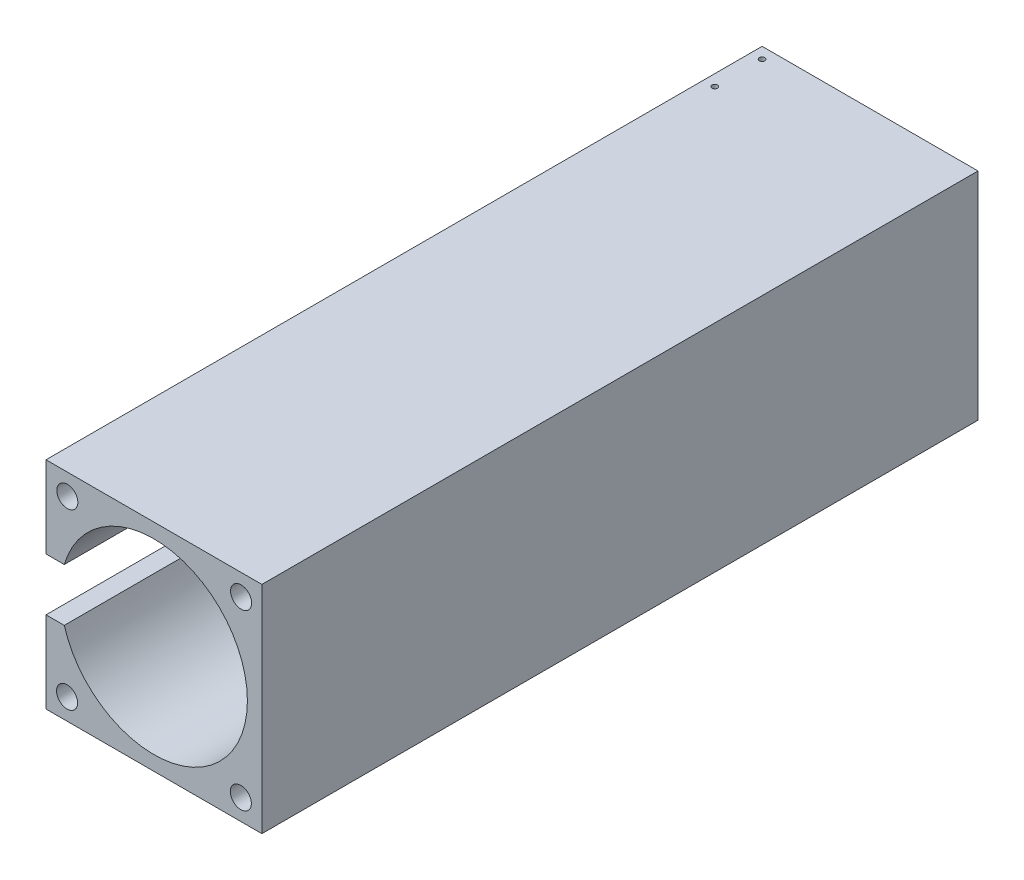
ISO-10303-21;
HEADER;
FILE_DESCRIPTION(('STEP AP214'),'2;1');
FILE_NAME('part.step','',(''),(''),'','','');
FILE_SCHEMA(('AUTOMOTIVE_DESIGN { 1 0 10303 214 1 1 1 1 }'));
ENDSEC;
DATA;
#1=APPLICATION_CONTEXT('core data for automotive mechanical design processes');
#2=APPLICATION_PROTOCOL_DEFINITION('international standard','automotive_design',2000,#1);
#3=PRODUCT_CONTEXT('',#1,'mechanical');
#4=PRODUCT('Part','Part','',(#3));
#5=PRODUCT_RELATED_PRODUCT_CATEGORY('part','',(#4));
#6=PRODUCT_DEFINITION_FORMATION('','',#4);
#7=PRODUCT_DEFINITION_CONTEXT('part definition',#1,'design');
#8=PRODUCT_DEFINITION('design','',#6,#7);
#9=PRODUCT_DEFINITION_SHAPE('','',#8);
#10=(LENGTH_UNIT() NAMED_UNIT(*) SI_UNIT(.MILLI.,.METRE.));
#11=(NAMED_UNIT(*) PLANE_ANGLE_UNIT() SI_UNIT($,.RADIAN.));
#12=(NAMED_UNIT(*) SI_UNIT($,.STERADIAN.) SOLID_ANGLE_UNIT());
#13=UNCERTAINTY_MEASURE_WITH_UNIT(LENGTH_MEASURE(1.E-05),#10,'distance_accuracy_value','');
#14=(GEOMETRIC_REPRESENTATION_CONTEXT(3) GLOBAL_UNCERTAINTY_ASSIGNED_CONTEXT((#13)) GLOBAL_UNIT_ASSIGNED_CONTEXT((#10,
#11,#12)) REPRESENTATION_CONTEXT('',''));
#15=CARTESIAN_POINT('',(0.,0.,0.));
#16=DIRECTION('',(0.,0.,1.));
#17=DIRECTION('',(1.,0.,0.));
#18=AXIS2_PLACEMENT_3D('',#15,#16,#17);
#19=CARTESIAN_POINT('',(0.,0.,245.));
#20=DIRECTION('',(0.,0.,-1.));
#21=DIRECTION('',(-1.,0.,0.));
#22=AXIS2_PLACEMENT_3D('',#19,#20,#21);
#23=PLANE('',#22);
#24=CARTESIAN_POINT('',(-32.9999999999981,-33.,245.));
#25=DIRECTION('',(0.,0.,1.));
#26=DIRECTION('',(1.,0.,0.));
#27=AXIS2_PLACEMENT_3D('',#24,#25,#26);
#28=CIRCLE('',#27,4.000000000001);
#29=CARTESIAN_POINT('',(-28.9999999999971,-33.,245.));
#30=VERTEX_POINT('',#29);
#31=EDGE_CURVE('E363',#30,#30,#28,.T.);
#32=ORIENTED_EDGE('',*,*,#31,.F.);
#33=EDGE_LOOP('',(#32));
#34=FACE_BOUND('',#33,.T.);
#35=CARTESIAN_POINT('',(33.0000000000019,-33.0999999999982,245.));
#36=DIRECTION('',(0.,0.,1.));
#37=DIRECTION('',(1.,0.,0.));
#38=AXIS2_PLACEMENT_3D('',#35,#36,#37);
#39=CIRCLE('',#38,4.00000000000001);
#40=CARTESIAN_POINT('',(37.0000000000019,-33.0999999999982,245.));
#41=VERTEX_POINT('',#40);
#42=EDGE_CURVE('E367',#41,#41,#39,.T.);
#43=ORIENTED_EDGE('',*,*,#42,.F.);
#44=EDGE_LOOP('',(#43));
#45=FACE_BOUND('',#44,.T.);
#46=CARTESIAN_POINT('',(33.1000000000001,32.9000000000018,245.));
#47=DIRECTION('',(0.,0.,1.));
#48=DIRECTION('',(1.,0.,0.));
#49=AXIS2_PLACEMENT_3D('',#46,#47,#48);
#50=CIRCLE('',#49,4.);
#51=CARTESIAN_POINT('',(37.1000000000001,32.9000000000018,245.));
#52=VERTEX_POINT('',#51);
#53=EDGE_CURVE('E362',#52,#52,#50,.T.);
#54=ORIENTED_EDGE('',*,*,#53,.F.);
#55=EDGE_LOOP('',(#54));
#56=FACE_BOUND('',#55,.T.);
#57=CARTESIAN_POINT('',(-32.9,33.,245.));
#58=DIRECTION('',(0.,0.,1.));
#59=DIRECTION('',(1.,0.,0.));
#60=AXIS2_PLACEMENT_3D('',#57,#58,#59);
#61=CIRCLE('',#60,4.);
#62=CARTESIAN_POINT('',(-28.9,33.,245.));
#63=VERTEX_POINT('',#62);
#64=EDGE_CURVE('E357',#63,#63,#61,.T.);
#65=ORIENTED_EDGE('',*,*,#64,.F.);
#66=EDGE_LOOP('',(#65));
#67=FACE_BOUND('',#66,.T.);
#68=CARTESIAN_POINT('',(0.,0.,245.));
#69=DIRECTION('',(0.,0.,1.));
#70=DIRECTION('',(1.,0.,0.));
#71=AXIS2_PLACEMENT_3D('',#68,#69,#70);
#72=CIRCLE('',#71,35.5);
#73=CARTESIAN_POINT('',(-34.0624426605022,-10.,245.));
#74=VERTEX_POINT('',#73);
#75=CARTESIAN_POINT('',(-34.0624426605022,10.,245.));
#76=VERTEX_POINT('',#75);
#77=EDGE_CURVE('E136',#74,#76,#72,.T.);
#78=ORIENTED_EDGE('',*,*,#77,.F.);
#79=DIRECTION('',(1.,0.,0.));
#80=VECTOR('',#79,1.);
#81=CARTESIAN_POINT('',(-41.,-10.,245.));
#82=LINE('',#81,#80);
#83=CARTESIAN_POINT('',(-41.,-10.,245.));
#84=VERTEX_POINT('',#83);
#85=EDGE_CURVE('E116',#84,#74,#82,.T.);
#86=ORIENTED_EDGE('',*,*,#85,.F.);
#87=DIRECTION('',(0.,-1.,0.));
#88=VECTOR('',#87,1.);
#89=CARTESIAN_POINT('',(-41.,-41.,245.));
#90=LINE('',#89,#88);
#91=CARTESIAN_POINT('',(-41.,-41.,245.));
#92=VERTEX_POINT('',#91);
#93=EDGE_CURVE('E130',#84,#92,#90,.T.);
#94=ORIENTED_EDGE('',*,*,#93,.T.);
#95=DIRECTION('',(1.,0.,0.));
#96=VECTOR('',#95,1.);
#97=CARTESIAN_POINT('',(-41.,-41.,245.));
#98=LINE('',#97,#96);
#99=CARTESIAN_POINT('',(41.,-41.,245.));
#100=VERTEX_POINT('',#99);
#101=EDGE_CURVE('E129',#92,#100,#98,.T.);
#102=ORIENTED_EDGE('',*,*,#101,.T.);
#103=DIRECTION('',(0.,1.,0.));
#104=VECTOR('',#103,1.);
#105=CARTESIAN_POINT('',(41.,-41.,245.));
#106=LINE('',#105,#104);
#107=CARTESIAN_POINT('',(41.,41.,245.));
#108=VERTEX_POINT('',#107);
#109=EDGE_CURVE('E134',#100,#108,#106,.T.);
#110=ORIENTED_EDGE('',*,*,#109,.T.);
#111=DIRECTION('',(-1.,0.,0.));
#112=VECTOR('',#111,1.);
#113=CARTESIAN_POINT('',(-41.,41.,245.));
#114=LINE('',#113,#112);
#115=CARTESIAN_POINT('',(-41.,41.,245.));
#116=VERTEX_POINT('',#115);
#117=EDGE_CURVE('E65',#108,#116,#114,.T.);
#118=ORIENTED_EDGE('',*,*,#117,.T.);
#119=CARTESIAN_POINT('',(-41.,10.,245.));
#120=VERTEX_POINT('',#119);
#121=EDGE_CURVE('E122',#116,#120,#90,.T.);
#122=ORIENTED_EDGE('',*,*,#121,.T.);
#123=DIRECTION('',(-1.,0.,0.));
#124=VECTOR('',#123,1.);
#125=CARTESIAN_POINT('',(-41.,10.,245.));
#126=LINE('',#125,#124);
#127=EDGE_CURVE('E106',#76,#120,#126,.T.);
#128=ORIENTED_EDGE('',*,*,#127,.F.);
#129=EDGE_LOOP('',(#78,#86,#94,#102,#110,#118,#122,#128));
#130=FACE_BOUND('',#129,.T.);
#131=ADVANCED_FACE('F40',(#34,#45,#56,#67,#130),#23,.F.);
#132=CARTESIAN_POINT('',(-41.,-41.,245.));
#133=DIRECTION('',(1.,0.,0.));
#134=DIRECTION('',(0.,0.,-1.));
#135=AXIS2_PLACEMENT_3D('',#132,#133,#134);
#136=PLANE('',#135);
#137=ORIENTED_EDGE('',*,*,#93,.F.);
#138=DIRECTION('',(0.,0.,1.));
#139=VECTOR('',#138,1.);
#140=CARTESIAN_POINT('',(-41.,-10.,-21.540659228538));
#141=LINE('',#140,#139);
#142=CARTESIAN_POINT('',(-41.,-10.,0.));
#143=VERTEX_POINT('',#142);
#144=EDGE_CURVE('E347',#143,#84,#141,.T.);
#145=ORIENTED_EDGE('',*,*,#144,.F.);
#146=DIRECTION('',(0.,-1.,0.));
#147=VECTOR('',#146,1.);
#148=CARTESIAN_POINT('',(-41.,10.,0.));
#149=LINE('',#148,#147);
#150=CARTESIAN_POINT('',(-41.,10.,0.));
#151=VERTEX_POINT('',#150);
#152=EDGE_CURVE('E125',#151,#143,#149,.T.);
#153=ORIENTED_EDGE('',*,*,#152,.F.);
#154=DIRECTION('',(0.,0.,1.));
#155=VECTOR('',#154,1.);
#156=CARTESIAN_POINT('',(-41.,10.,-21.540659228538));
#157=LINE('',#156,#155);
#158=EDGE_CURVE('E109',#151,#120,#157,.T.);
#159=ORIENTED_EDGE('',*,*,#158,.T.);
#160=ORIENTED_EDGE('',*,*,#121,.F.);
#161=DIRECTION('',(0.,0.,-1.));
#162=VECTOR('',#161,1.);
#163=CARTESIAN_POINT('',(-41.,41.,245.));
#164=LINE('',#163,#162);
#165=CARTESIAN_POINT('',(-41.,41.,-27.));
#166=VERTEX_POINT('',#165);
#167=EDGE_CURVE('E145',#116,#166,#164,.T.);
#168=ORIENTED_EDGE('',*,*,#167,.T.);
#169=DIRECTION('',(0.,1.,0.));
#170=VECTOR('',#169,1.);
#171=CARTESIAN_POINT('',(-41.,41.,-27.));
#172=LINE('',#171,#170);
#173=CARTESIAN_POINT('',(-41.,-41.,-27.));
#174=VERTEX_POINT('',#173);
#175=EDGE_CURVE('E326',#174,#166,#172,.T.);
#176=ORIENTED_EDGE('',*,*,#175,.F.);
#177=DIRECTION('',(0.,0.,-1.));
#178=VECTOR('',#177,1.);
#179=CARTESIAN_POINT('',(-41.,-41.,245.));
#180=LINE('',#179,#178);
#181=EDGE_CURVE('E154',#92,#174,#180,.T.);
#182=ORIENTED_EDGE('',*,*,#181,.F.);
#183=EDGE_LOOP('',(#137,#145,#153,#159,#160,#168,#176,#182));
#184=FACE_BOUND('',#183,.T.);
#185=ADVANCED_FACE('F121',(#184),#136,.F.);
#186=CARTESIAN_POINT('',(-41.,-41.,245.));
#187=DIRECTION('',(0.,1.,0.));
#188=DIRECTION('',(0.,0.,1.));
#189=AXIS2_PLACEMENT_3D('',#186,#187,#188);
#190=PLANE('',#189);
#191=ORIENTED_EDGE('',*,*,#181,.T.);
#192=DIRECTION('',(-1.,0.,0.));
#193=VECTOR('',#192,1.);
#194=CARTESIAN_POINT('',(41.,-41.,-27.));
#195=LINE('',#194,#193);
#196=CARTESIAN_POINT('',(41.,-41.,-27.));
#197=VERTEX_POINT('',#196);
#198=EDGE_CURVE('E333',#197,#174,#195,.T.);
#199=ORIENTED_EDGE('',*,*,#198,.F.);
#200=DIRECTION('',(0.,0.,-1.));
#201=VECTOR('',#200,1.);
#202=CARTESIAN_POINT('',(41.,-41.,245.));
#203=LINE('',#202,#201);
#204=EDGE_CURVE('E151',#100,#197,#203,.T.);
#205=ORIENTED_EDGE('',*,*,#204,.F.);
#206=ORIENTED_EDGE('',*,*,#101,.F.);
#207=EDGE_LOOP('',(#191,#199,#205,#206));
#208=FACE_BOUND('',#207,.T.);
#209=ADVANCED_FACE('F241',(#208),#190,.F.);
#210=CARTESIAN_POINT('',(41.,-41.,245.));
#211=DIRECTION('',(-1.,0.,0.));
#212=DIRECTION('',(0.,0.,1.));
#213=AXIS2_PLACEMENT_3D('',#210,#211,#212);
#214=PLANE('',#213);
#215=ORIENTED_EDGE('',*,*,#204,.T.);
#216=DIRECTION('',(0.,-1.,0.));
#217=VECTOR('',#216,1.);
#218=CARTESIAN_POINT('',(41.,41.,-27.));
#219=LINE('',#218,#217);
#220=CARTESIAN_POINT('',(41.,41.,-27.));
#221=VERTEX_POINT('',#220);
#222=EDGE_CURVE('E339',#221,#197,#219,.T.);
#223=ORIENTED_EDGE('',*,*,#222,.F.);
#224=DIRECTION('',(0.,0.,-1.));
#225=VECTOR('',#224,1.);
#226=CARTESIAN_POINT('',(41.,41.,245.));
#227=LINE('',#226,#225);
#228=EDGE_CURVE('E148',#108,#221,#227,.T.);
#229=ORIENTED_EDGE('',*,*,#228,.F.);
#230=ORIENTED_EDGE('',*,*,#109,.F.);
#231=EDGE_LOOP('',(#215,#223,#229,#230));
#232=FACE_BOUND('',#231,.T.);
#233=ADVANCED_FACE('F252',(#232),#214,.F.);
#234=CARTESIAN_POINT('',(-41.,41.,245.));
#235=DIRECTION('',(0.,-1.,0.));
#236=DIRECTION('',(0.,0.,-1.));
#237=AXIS2_PLACEMENT_3D('',#234,#235,#236);
#238=PLANE('',#237);
#239=CARTESIAN_POINT('',(-36.75,41.,-22.75));
#240=DIRECTION('',(0.,1.,0.));
#241=DIRECTION('',(0.,0.,1.));
#242=AXIS2_PLACEMENT_3D('',#239,#240,#241);
#243=CIRCLE('',#242,1.05);
#244=CARTESIAN_POINT('',(-36.75,41.,-21.7));
#245=VERTEX_POINT('',#244);
#246=EDGE_CURVE('E384',#245,#245,#243,.T.);
#247=ORIENTED_EDGE('',*,*,#246,.F.);
#248=EDGE_LOOP('',(#247));
#249=FACE_BOUND('',#248,.T.);
#250=CARTESIAN_POINT('',(-36.75,41.,-4.74999999999999));
#251=DIRECTION('',(0.,1.,0.));
#252=DIRECTION('',(0.,0.,1.));
#253=AXIS2_PLACEMENT_3D('',#250,#251,#252);
#254=CIRCLE('',#253,1.05);
#255=CARTESIAN_POINT('',(-36.75,41.,-3.69999999999999));
#256=VERTEX_POINT('',#255);
#257=EDGE_CURVE('E375',#256,#256,#254,.T.);
#258=ORIENTED_EDGE('',*,*,#257,.F.);
#259=EDGE_LOOP('',(#258));
#260=FACE_BOUND('',#259,.T.);
#261=ORIENTED_EDGE('',*,*,#228,.T.);
#262=DIRECTION('',(1.,0.,0.));
#263=VECTOR('',#262,1.);
#264=CARTESIAN_POINT('',(41.,41.,-27.));
#265=LINE('',#264,#263);
#266=EDGE_CURVE('E322',#166,#221,#265,.T.);
#267=ORIENTED_EDGE('',*,*,#266,.F.);
#268=ORIENTED_EDGE('',*,*,#167,.F.);
#269=ORIENTED_EDGE('',*,*,#117,.F.);
#270=EDGE_LOOP('',(#261,#267,#268,#269));
#271=FACE_BOUND('',#270,.T.);
#272=ADVANCED_FACE('F249',(#249,#260,#271),#238,.F.);
#273=CARTESIAN_POINT('',(0.,0.,245.));
#274=DIRECTION('',(0.,0.,-1.));
#275=DIRECTION('',(-1.,0.,0.));
#276=AXIS2_PLACEMENT_3D('',#273,#274,#275);
#277=CYLINDRICAL_SURFACE('',#276,35.5);
#278=DIRECTION('',(0.,0.,-1.));
#279=VECTOR('',#278,1.);
#280=CARTESIAN_POINT('',(-34.0624426605022,-10.,245.));
#281=LINE('',#280,#279);
#282=CARTESIAN_POINT('',(-34.0624426605022,-10.,0.));
#283=VERTEX_POINT('',#282);
#284=EDGE_CURVE('E342',#74,#283,#281,.T.);
#285=ORIENTED_EDGE('',*,*,#284,.F.);
#286=ORIENTED_EDGE('',*,*,#77,.T.);
#287=DIRECTION('',(0.,0.,-1.));
#288=VECTOR('',#287,1.);
#289=CARTESIAN_POINT('',(-34.0624426605022,10.,245.));
#290=LINE('',#289,#288);
#291=CARTESIAN_POINT('',(-34.0624426605022,10.,0.));
#292=VERTEX_POINT('',#291);
#293=EDGE_CURVE('E111',#292,#76,#290,.F.);
#294=ORIENTED_EDGE('',*,*,#293,.F.);
#295=CARTESIAN_POINT('',(0.,0.,0.));
#296=DIRECTION('',(0.,0.,1.));
#297=DIRECTION('',(1.,0.,0.));
#298=AXIS2_PLACEMENT_3D('',#295,#296,#297);
#299=CIRCLE('',#298,35.5);
#300=EDGE_CURVE('E138',#283,#292,#299,.T.);
#301=ORIENTED_EDGE('',*,*,#300,.F.);
#302=EDGE_LOOP('',(#285,#286,#294,#301));
#303=FACE_BOUND('',#302,.T.);
#304=ADVANCED_FACE('F247',(#303),#277,.F.);
#305=CARTESIAN_POINT('',(0.,0.,0.));
#306=DIRECTION('',(0.,0.,-1.));
#307=DIRECTION('',(-1.,0.,0.));
#308=AXIS2_PLACEMENT_3D('',#305,#306,#307);
#309=PLANE('',#308);
#310=ORIENTED_EDGE('',*,*,#300,.T.);
#311=DIRECTION('',(-1.,0.,0.));
#312=VECTOR('',#311,1.);
#313=CARTESIAN_POINT('',(-41.,10.,0.));
#314=LINE('',#313,#312);
#315=EDGE_CURVE('E57',#292,#151,#314,.T.);
#316=ORIENTED_EDGE('',*,*,#315,.T.);
#317=ORIENTED_EDGE('',*,*,#152,.T.);
#318=DIRECTION('',(1.,0.,0.));
#319=VECTOR('',#318,1.);
#320=CARTESIAN_POINT('',(-41.,-10.,0.));
#321=LINE('',#320,#319);
#322=EDGE_CURVE('E115',#143,#283,#321,.T.);
#323=ORIENTED_EDGE('',*,*,#322,.T.);
#324=EDGE_LOOP('',(#310,#316,#317,#323));
#325=FACE_BOUND('',#324,.T.);
#326=ADVANCED_FACE('F309',(#325),#309,.F.);
#327=CARTESIAN_POINT('',(0.,0.,-27.));
#328=DIRECTION('',(0.,0.,-1.));
#329=DIRECTION('',(-1.,0.,0.));
#330=AXIS2_PLACEMENT_3D('',#327,#328,#329);
#331=PLANE('',#330);
#332=ORIENTED_EDGE('',*,*,#222,.T.);
#333=ORIENTED_EDGE('',*,*,#198,.T.);
#334=ORIENTED_EDGE('',*,*,#175,.T.);
#335=ORIENTED_EDGE('',*,*,#266,.T.);
#336=EDGE_LOOP('',(#332,#333,#334,#335));
#337=FACE_BOUND('',#336,.T.);
#338=ADVANCED_FACE('F306',(#337),#331,.T.);
#339=CARTESIAN_POINT('',(-41.,-10.,-21.540659228538));
#340=DIRECTION('',(0.,-1.,0.));
#341=DIRECTION('',(0.,0.,-1.));
#342=AXIS2_PLACEMENT_3D('',#339,#340,#341);
#343=PLANE('',#342);
#344=ORIENTED_EDGE('',*,*,#284,.T.);
#345=ORIENTED_EDGE('',*,*,#322,.F.);
#346=ORIENTED_EDGE('',*,*,#144,.T.);
#347=ORIENTED_EDGE('',*,*,#85,.T.);
#348=EDGE_LOOP('',(#344,#345,#346,#347));
#349=FACE_BOUND('',#348,.T.);
#350=ADVANCED_FACE('F303',(#349),#343,.F.);
#351=CARTESIAN_POINT('',(-41.,10.,-21.540659228538));
#352=DIRECTION('',(0.,1.,0.));
#353=DIRECTION('',(0.,0.,1.));
#354=AXIS2_PLACEMENT_3D('',#351,#352,#353);
#355=PLANE('',#354);
#356=ORIENTED_EDGE('',*,*,#293,.T.);
#357=ORIENTED_EDGE('',*,*,#127,.T.);
#358=ORIENTED_EDGE('',*,*,#158,.F.);
#359=ORIENTED_EDGE('',*,*,#315,.F.);
#360=EDGE_LOOP('',(#356,#357,#358,#359));
#361=FACE_BOUND('',#360,.T.);
#362=ADVANCED_FACE('F108',(#361),#355,.F.);
#363=CARTESIAN_POINT('',(-32.9,33.,225.));
#364=DIRECTION('',(0.,0.,1.));
#365=DIRECTION('',(1.,0.,0.));
#366=AXIS2_PLACEMENT_3D('',#363,#364,#365);
#367=CYLINDRICAL_SURFACE('',#366,4.);
#368=CARTESIAN_POINT('',(-32.9,33.,228.));
#369=DIRECTION('',(0.,0.,1.));
#370=DIRECTION('',(1.,0.,0.));
#371=AXIS2_PLACEMENT_3D('',#368,#369,#370);
#372=CIRCLE('',#371,4.);
#373=CARTESIAN_POINT('',(-28.9,33.,228.));
#374=VERTEX_POINT('',#373);
#375=EDGE_CURVE('E161',#374,#374,#372,.F.);
#376=ORIENTED_EDGE('',*,*,#375,.T.);
#377=EDGE_LOOP('',(#376));
#378=FACE_BOUND('',#377,.T.);
#379=ORIENTED_EDGE('',*,*,#64,.T.);
#380=EDGE_LOOP('',(#379));
#381=FACE_BOUND('',#380,.T.);
#382=ADVANCED_FACE('F296',(#378,#381),#367,.F.);
#383=CARTESIAN_POINT('',(-32.9,33.,225.));
#384=DIRECTION('',(0.,0.,1.));
#385=DIRECTION('',(1.,0.,0.));
#386=AXIS2_PLACEMENT_3D('',#383,#384,#385);
#387=PLANE('',#386);
#388=CARTESIAN_POINT('',(-32.9,33.,225.));
#389=DIRECTION('',(0.,0.,1.));
#390=DIRECTION('',(1.,0.,0.));
#391=AXIS2_PLACEMENT_3D('',#388,#389,#390);
#392=CIRCLE('',#391,1.);
#393=CARTESIAN_POINT('',(-31.9,33.,225.));
#394=VERTEX_POINT('',#393);
#395=EDGE_CURVE('E157',#394,#394,#392,.T.);
#396=ORIENTED_EDGE('',*,*,#395,.T.);
#397=EDGE_LOOP('',(#396));
#398=FACE_BOUND('',#397,.T.);
#399=ADVANCED_FACE('F292',(#398),#387,.T.);
#400=CARTESIAN_POINT('',(33.1000000000001,32.9000000000018,225.));
#401=DIRECTION('',(0.,0.,1.));
#402=DIRECTION('',(1.,0.,0.));
#403=AXIS2_PLACEMENT_3D('',#400,#401,#402);
#404=CYLINDRICAL_SURFACE('',#403,4.);
#405=CARTESIAN_POINT('',(33.1000000000001,32.9000000000018,228.));
#406=DIRECTION('',(0.,0.,1.));
#407=DIRECTION('',(1.,0.,0.));
#408=AXIS2_PLACEMENT_3D('',#405,#406,#407);
#409=CIRCLE('',#408,4.);
#410=CARTESIAN_POINT('',(37.1000000000001,32.9000000000018,228.));
#411=VERTEX_POINT('',#410);
#412=EDGE_CURVE('E169',#411,#411,#409,.F.);
#413=ORIENTED_EDGE('',*,*,#412,.T.);
#414=EDGE_LOOP('',(#413));
#415=FACE_BOUND('',#414,.T.);
#416=ORIENTED_EDGE('',*,*,#53,.T.);
#417=EDGE_LOOP('',(#416));
#418=FACE_BOUND('',#417,.T.);
#419=ADVANCED_FACE('F295',(#415,#418),#404,.F.);
#420=CARTESIAN_POINT('',(33.1000000000001,32.9000000000018,225.));
#421=DIRECTION('',(0.,0.,1.));
#422=DIRECTION('',(1.,0.,0.));
#423=AXIS2_PLACEMENT_3D('',#420,#421,#422);
#424=PLANE('',#423);
#425=CARTESIAN_POINT('',(33.1000000000001,32.9000000000018,225.));
#426=DIRECTION('',(0.,0.,1.));
#427=DIRECTION('',(1.,0.,0.));
#428=AXIS2_PLACEMENT_3D('',#425,#426,#427);
#429=CIRCLE('',#428,0.999999999999997);
#430=CARTESIAN_POINT('',(34.1,32.9000000000018,225.));
#431=VERTEX_POINT('',#430);
#432=EDGE_CURVE('E165',#431,#431,#429,.T.);
#433=ORIENTED_EDGE('',*,*,#432,.T.);
#434=EDGE_LOOP('',(#433));
#435=FACE_BOUND('',#434,.T.);
#436=ADVANCED_FACE('F511',(#435),#424,.T.);
#437=CARTESIAN_POINT('',(33.0000000000019,-33.0999999999982,225.));
#438=DIRECTION('',(0.,0.,1.));
#439=DIRECTION('',(1.,0.,0.));
#440=AXIS2_PLACEMENT_3D('',#437,#438,#439);
#441=CYLINDRICAL_SURFACE('',#440,4.00000000000001);
#442=CARTESIAN_POINT('',(33.0000000000019,-33.0999999999982,228.));
#443=DIRECTION('',(0.,0.,1.));
#444=DIRECTION('',(1.,0.,0.));
#445=AXIS2_PLACEMENT_3D('',#442,#443,#444);
#446=CIRCLE('',#445,4.00000000000001);
#447=CARTESIAN_POINT('',(37.0000000000019,-33.0999999999982,228.));
#448=VERTEX_POINT('',#447);
#449=EDGE_CURVE('E185',#448,#448,#446,.F.);
#450=ORIENTED_EDGE('',*,*,#449,.T.);
#451=EDGE_LOOP('',(#450));
#452=FACE_BOUND('',#451,.T.);
#453=ORIENTED_EDGE('',*,*,#42,.T.);
#454=EDGE_LOOP('',(#453));
#455=FACE_BOUND('',#454,.T.);
#456=ADVANCED_FACE('F289',(#452,#455),#441,.F.);
#457=CARTESIAN_POINT('',(33.0000000000019,-33.0999999999982,225.));
#458=DIRECTION('',(0.,0.,1.));
#459=DIRECTION('',(1.,0.,0.));
#460=AXIS2_PLACEMENT_3D('',#457,#458,#459);
#461=PLANE('',#460);
#462=CARTESIAN_POINT('',(33.0000000000019,-33.0999999999982,225.));
#463=DIRECTION('',(0.,0.,1.));
#464=DIRECTION('',(1.,0.,0.));
#465=AXIS2_PLACEMENT_3D('',#462,#463,#464);
#466=CIRCLE('',#465,1.00000000000001);
#467=CARTESIAN_POINT('',(34.0000000000019,-33.0999999999982,225.));
#468=VERTEX_POINT('',#467);
#469=EDGE_CURVE('E181',#468,#468,#466,.T.);
#470=ORIENTED_EDGE('',*,*,#469,.T.);
#471=EDGE_LOOP('',(#470));
#472=FACE_BOUND('',#471,.T.);
#473=ADVANCED_FACE('F285',(#472),#461,.T.);
#474=CARTESIAN_POINT('',(-32.9999999999981,-33.,225.));
#475=DIRECTION('',(0.,0.,1.));
#476=DIRECTION('',(1.,0.,0.));
#477=AXIS2_PLACEMENT_3D('',#474,#475,#476);
#478=CYLINDRICAL_SURFACE('',#477,4.000000000001);
#479=CARTESIAN_POINT('',(-32.9999999999981,-33.,228.));
#480=DIRECTION('',(0.,0.,1.));
#481=DIRECTION('',(1.,0.,0.));
#482=AXIS2_PLACEMENT_3D('',#479,#480,#481);
#483=CIRCLE('',#482,4.000000000001);
#484=CARTESIAN_POINT('',(-28.9999999999971,-33.,228.));
#485=VERTEX_POINT('',#484);
#486=EDGE_CURVE('E177',#485,#485,#483,.F.);
#487=ORIENTED_EDGE('',*,*,#486,.T.);
#488=EDGE_LOOP('',(#487));
#489=FACE_BOUND('',#488,.T.);
#490=ORIENTED_EDGE('',*,*,#31,.T.);
#491=EDGE_LOOP('',(#490));
#492=FACE_BOUND('',#491,.T.);
#493=ADVANCED_FACE('F280',(#489,#492),#478,.F.);
#494=CARTESIAN_POINT('',(-32.9999999999981,-33.,225.));
#495=DIRECTION('',(0.,0.,1.));
#496=DIRECTION('',(1.,0.,0.));
#497=AXIS2_PLACEMENT_3D('',#494,#495,#496);
#498=PLANE('',#497);
#499=CARTESIAN_POINT('',(-32.9999999999981,-33.,225.));
#500=DIRECTION('',(0.,0.,1.));
#501=DIRECTION('',(1.,0.,0.));
#502=AXIS2_PLACEMENT_3D('',#499,#500,#501);
#503=CIRCLE('',#502,1.000000000001);
#504=CARTESIAN_POINT('',(-31.9999999999971,-33.,225.));
#505=VERTEX_POINT('',#504);
#506=EDGE_CURVE('E173',#505,#505,#503,.T.);
#507=ORIENTED_EDGE('',*,*,#506,.T.);
#508=EDGE_LOOP('',(#507));
#509=FACE_BOUND('',#508,.T.);
#510=ADVANCED_FACE('F264',(#509),#498,.T.);
#511=CARTESIAN_POINT('',(-32.9,33.,228.));
#512=DIRECTION('',(0.,0.,1.));
#513=DIRECTION('',(1.,0.,0.));
#514=AXIS2_PLACEMENT_3D('',#511,#512,#513);
#515=DEGENERATE_TOROIDAL_SURFACE('',#514,1.,3.,.T.);
#516=ORIENTED_EDGE('',*,*,#375,.F.);
#517=EDGE_LOOP('',(#516));
#518=FACE_BOUND('',#517,.T.);
#519=ORIENTED_EDGE('',*,*,#395,.F.);
#520=EDGE_LOOP('',(#519));
#521=FACE_BOUND('',#520,.T.);
#522=ADVANCED_FACE('F260',(#518,#521),#515,.F.);
#523=CARTESIAN_POINT('',(33.1000000000001,32.9000000000018,228.));
#524=DIRECTION('',(0.,0.,1.));
#525=DIRECTION('',(1.,0.,0.));
#526=AXIS2_PLACEMENT_3D('',#523,#524,#525);
#527=DEGENERATE_TOROIDAL_SURFACE('',#526,0.999999999999997,3.,.T.);
#528=ORIENTED_EDGE('',*,*,#412,.F.);
#529=EDGE_LOOP('',(#528));
#530=FACE_BOUND('',#529,.T.);
#531=ORIENTED_EDGE('',*,*,#432,.F.);
#532=EDGE_LOOP('',(#531));
#533=FACE_BOUND('',#532,.T.);
#534=ADVANCED_FACE('F263',(#530,#533),#527,.F.);
#535=CARTESIAN_POINT('',(-32.9999999999981,-33.,228.));
#536=DIRECTION('',(0.,0.,1.));
#537=DIRECTION('',(1.,0.,0.));
#538=AXIS2_PLACEMENT_3D('',#535,#536,#537);
#539=DEGENERATE_TOROIDAL_SURFACE('',#538,1.000000000001,3.,.T.);
#540=ORIENTED_EDGE('',*,*,#486,.F.);
#541=EDGE_LOOP('',(#540));
#542=FACE_BOUND('',#541,.T.);
#543=ORIENTED_EDGE('',*,*,#506,.F.);
#544=EDGE_LOOP('',(#543));
#545=FACE_BOUND('',#544,.T.);
#546=ADVANCED_FACE('F267',(#542,#545),#539,.F.);
#547=CARTESIAN_POINT('',(33.0000000000019,-33.0999999999982,228.));
#548=DIRECTION('',(0.,0.,1.));
#549=DIRECTION('',(1.,0.,0.));
#550=AXIS2_PLACEMENT_3D('',#547,#548,#549);
#551=DEGENERATE_TOROIDAL_SURFACE('',#550,1.00000000000001,3.,.T.);
#552=ORIENTED_EDGE('',*,*,#449,.F.);
#553=EDGE_LOOP('',(#552));
#554=FACE_BOUND('',#553,.T.);
#555=ORIENTED_EDGE('',*,*,#469,.F.);
#556=EDGE_LOOP('',(#555));
#557=FACE_BOUND('',#556,.T.);
#558=ADVANCED_FACE('F42',(#554,#557),#551,.F.);
#559=CARTESIAN_POINT('',(-36.75,31.,-4.74999999999999));
#560=DIRECTION('',(0.,1.,0.));
#561=DIRECTION('',(0.,0.,1.));
#562=AXIS2_PLACEMENT_3D('',#559,#560,#561);
#563=CYLINDRICAL_SURFACE('',#562,1.05);
#564=CARTESIAN_POINT('',(-36.75,35.2,-4.74999999999999));
#565=DIRECTION('',(0.,1.,0.));
#566=DIRECTION('',(0.,0.,1.));
#567=AXIS2_PLACEMENT_3D('',#564,#565,#566);
#568=CIRCLE('',#567,1.05);
#569=CARTESIAN_POINT('',(-36.75,35.2,-3.69999999999999));
#570=VERTEX_POINT('',#569);
#571=EDGE_CURVE('E394',#570,#570,#568,.T.);
#572=ORIENTED_EDGE('',*,*,#571,.F.);
#573=EDGE_LOOP('',(#572));
#574=FACE_BOUND('',#573,.T.);
#575=ORIENTED_EDGE('',*,*,#257,.T.);
#576=EDGE_LOOP('',(#575));
#577=FACE_BOUND('',#576,.T.);
#578=ADVANCED_FACE('F211',(#574,#577),#563,.F.);
#579=CARTESIAN_POINT('',(-36.75,31.,-22.75));
#580=DIRECTION('',(0.,1.,0.));
#581=DIRECTION('',(0.,0.,1.));
#582=AXIS2_PLACEMENT_3D('',#579,#580,#581);
#583=CYLINDRICAL_SURFACE('',#582,1.05);
#584=CARTESIAN_POINT('',(-36.75,35.2,-22.75));
#585=DIRECTION('',(0.,1.,0.));
#586=DIRECTION('',(0.,0.,1.));
#587=AXIS2_PLACEMENT_3D('',#584,#585,#586);
#588=CIRCLE('',#587,1.05);
#589=CARTESIAN_POINT('',(-36.75,35.2,-21.7));
#590=VERTEX_POINT('',#589);
#591=EDGE_CURVE('E380',#590,#590,#588,.T.);
#592=ORIENTED_EDGE('',*,*,#591,.F.);
#593=EDGE_LOOP('',(#592));
#594=FACE_BOUND('',#593,.T.);
#595=ORIENTED_EDGE('',*,*,#246,.T.);
#596=EDGE_LOOP('',(#595));
#597=FACE_BOUND('',#596,.T.);
#598=ADVANCED_FACE('F200',(#594,#597),#583,.F.);
#599=CARTESIAN_POINT('',(-36.75,35.2,-22.75));
#600=DIRECTION('',(0.,1.,0.));
#601=DIRECTION('',(0.,0.,1.));
#602=AXIS2_PLACEMENT_3D('',#599,#600,#601);
#603=PLANE('',#602);
#604=ORIENTED_EDGE('',*,*,#591,.T.);
#605=EDGE_LOOP('',(#604));
#606=FACE_BOUND('',#605,.T.);
#607=ADVANCED_FACE('F210',(#606),#603,.T.);
#608=CARTESIAN_POINT('',(-36.75,35.2,-4.74999999999999));
#609=DIRECTION('',(0.,1.,0.));
#610=DIRECTION('',(0.,0.,1.));
#611=AXIS2_PLACEMENT_3D('',#608,#609,#610);
#612=PLANE('',#611);
#613=ORIENTED_EDGE('',*,*,#571,.T.);
#614=EDGE_LOOP('',(#613));
#615=FACE_BOUND('',#614,.T.);
#616=ADVANCED_FACE('F222',(#615),#612,.T.);
#617=CLOSED_SHELL('',(#131,#185,#209,#233,#272,#304,#326,#338,#350,#362,#382,#399,#419,#436,
#456,#473,#493,#510,#522,#534,#546,#558,#578,#598,#607,#616));
#618=CARTESIAN_POINT('',(-36.75,35.,-4.74999999999999));
#619=DIRECTION('',(0.,1.,0.));
#620=DIRECTION('',(0.,0.,1.));
#621=AXIS2_PLACEMENT_3D('',#618,#619,#620);
#622=PLANE('',#621);
#623=CARTESIAN_POINT('',(-36.75,35.,-4.74999999999999));
#624=DIRECTION('',(0.,1.,0.));
#625=DIRECTION('',(0.,0.,1.));
#626=AXIS2_PLACEMENT_3D('',#623,#624,#625);
#627=CIRCLE('',#626,1.05);
#628=CARTESIAN_POINT('',(-36.75,35.,-3.69999999999999));
#629=VERTEX_POINT('',#628);
#630=EDGE_CURVE('E11',#629,#629,#627,.F.);
#631=ORIENTED_EDGE('',*,*,#630,.T.);
#632=EDGE_LOOP('',(#631));
#633=FACE_BOUND('',#632,.T.);
#634=ADVANCED_FACE('F224',(#633),#622,.F.);
#635=CARTESIAN_POINT('',(-36.75,31.,-4.74999999999999));
#636=DIRECTION('',(0.,1.,0.));
#637=DIRECTION('',(0.,0.,1.));
#638=AXIS2_PLACEMENT_3D('',#635,#636,#637);
#639=PLANE('',#638);
#640=CARTESIAN_POINT('',(-36.75,31.,-4.74999999999999));
#641=DIRECTION('',(0.,1.,0.));
#642=DIRECTION('',(0.,0.,1.));
#643=AXIS2_PLACEMENT_3D('',#640,#641,#642);
#644=CIRCLE('',#643,1.05);
#645=CARTESIAN_POINT('',(-36.75,31.,-3.69999999999999));
#646=VERTEX_POINT('',#645);
#647=EDGE_CURVE('E379',#646,#646,#644,.T.);
#648=ORIENTED_EDGE('',*,*,#647,.T.);
#649=EDGE_LOOP('',(#648));
#650=FACE_BOUND('',#649,.T.);
#651=ADVANCED_FACE('F227',(#650),#639,.T.);
#652=ORIENTED_EDGE('',*,*,#647,.F.);
#653=EDGE_LOOP('',(#652));
#654=FACE_BOUND('',#653,.T.);
#655=ORIENTED_EDGE('',*,*,#630,.F.);
#656=EDGE_LOOP('',(#655));
#657=FACE_BOUND('',#656,.T.);
#658=ADVANCED_FACE('F401',(#654,#657),#563,.F.);
#659=CLOSED_SHELL('',(#634,#651,#658));
#660=CARTESIAN_POINT('',(-36.75,35.,-22.75));
#661=DIRECTION('',(0.,1.,0.));
#662=DIRECTION('',(0.,0.,1.));
#663=AXIS2_PLACEMENT_3D('',#660,#661,#662);
#664=PLANE('',#663);
#665=CARTESIAN_POINT('',(-36.75,35.,-22.75));
#666=DIRECTION('',(0.,1.,0.));
#667=DIRECTION('',(0.,0.,1.));
#668=AXIS2_PLACEMENT_3D('',#665,#666,#667);
#669=CIRCLE('',#668,1.05);
#670=CARTESIAN_POINT('',(-36.75,35.,-21.7));
#671=VERTEX_POINT('',#670);
#672=EDGE_CURVE('E50',#671,#671,#669,.F.);
#673=ORIENTED_EDGE('',*,*,#672,.T.);
#674=EDGE_LOOP('',(#673));
#675=FACE_BOUND('',#674,.T.);
#676=ADVANCED_FACE('F192',(#675),#664,.F.);
#677=CARTESIAN_POINT('',(-36.75,31.,-22.75));
#678=DIRECTION('',(0.,1.,0.));
#679=DIRECTION('',(0.,0.,1.));
#680=AXIS2_PLACEMENT_3D('',#677,#678,#679);
#681=PLANE('',#680);
#682=CARTESIAN_POINT('',(-36.75,31.,-22.75));
#683=DIRECTION('',(0.,1.,0.));
#684=DIRECTION('',(0.,0.,1.));
#685=AXIS2_PLACEMENT_3D('',#682,#683,#684);
#686=CIRCLE('',#685,1.05);
#687=CARTESIAN_POINT('',(-36.75,31.,-21.7));
#688=VERTEX_POINT('',#687);
#689=EDGE_CURVE('E368',#688,#688,#686,.T.);
#690=ORIENTED_EDGE('',*,*,#689,.T.);
#691=EDGE_LOOP('',(#690));
#692=FACE_BOUND('',#691,.T.);
#693=ADVANCED_FACE('F196',(#692),#681,.T.);
#694=ORIENTED_EDGE('',*,*,#689,.F.);
#695=EDGE_LOOP('',(#694));
#696=FACE_BOUND('',#695,.T.);
#697=ORIENTED_EDGE('',*,*,#672,.F.);
#698=EDGE_LOOP('',(#697));
#699=FACE_BOUND('',#698,.T.);
#700=ADVANCED_FACE('F194',(#696,#699),#583,.F.);
#701=CLOSED_SHELL('',(#676,#693,#700));
#702=ORIENTED_CLOSED_SHELL('',*,#659,.T.);
#703=ORIENTED_CLOSED_SHELL('',*,#701,.T.);
#704=BREP_WITH_VOIDS('B2',#617,(#702,#703));
#705=ADVANCED_BREP_SHAPE_REPRESENTATION('',(#18,#704),#14);
#706=SHAPE_DEFINITION_REPRESENTATION(#9,#705);
ENDSEC;
END-ISO-10303-21;
